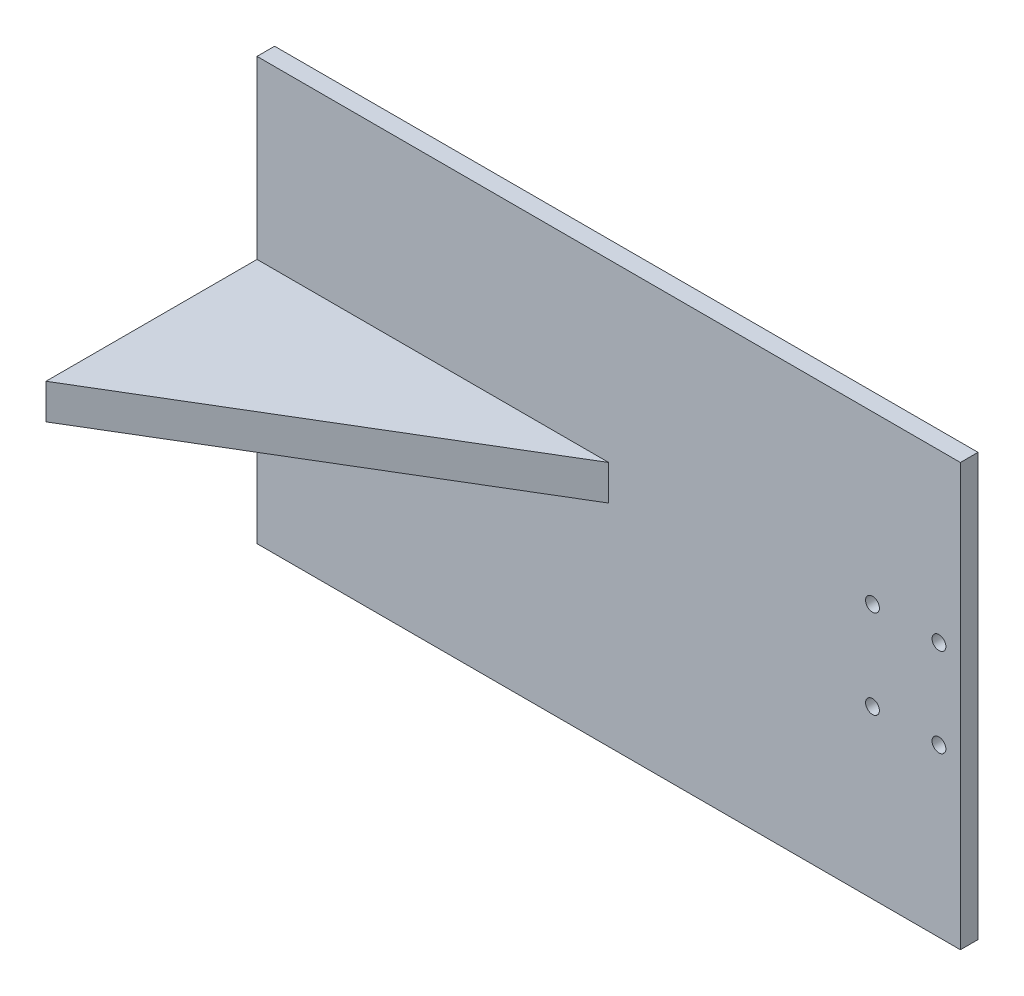
ISO-10303-21;
HEADER;
FILE_DESCRIPTION(('STEP AP214'),'2;1');
FILE_NAME('part.step','',(''),(''),'','','');
FILE_SCHEMA(('AUTOMOTIVE_DESIGN { 1 0 10303 214 1 1 1 1 }'));
ENDSEC;
DATA;
#1=APPLICATION_CONTEXT('core data for automotive mechanical design processes');
#2=APPLICATION_PROTOCOL_DEFINITION('international standard','automotive_design',2000,#1);
#3=PRODUCT_CONTEXT('',#1,'mechanical');
#4=PRODUCT('Part','Part','',(#3));
#5=PRODUCT_RELATED_PRODUCT_CATEGORY('part','',(#4));
#6=PRODUCT_DEFINITION_FORMATION('','',#4);
#7=PRODUCT_DEFINITION_CONTEXT('part definition',#1,'design');
#8=PRODUCT_DEFINITION('design','',#6,#7);
#9=PRODUCT_DEFINITION_SHAPE('','',#8);
#10=(LENGTH_UNIT() NAMED_UNIT(*) SI_UNIT(.MILLI.,.METRE.));
#11=(NAMED_UNIT(*) PLANE_ANGLE_UNIT() SI_UNIT($,.RADIAN.));
#12=(NAMED_UNIT(*) SI_UNIT($,.STERADIAN.) SOLID_ANGLE_UNIT());
#13=UNCERTAINTY_MEASURE_WITH_UNIT(LENGTH_MEASURE(1.E-05),#10,'distance_accuracy_value','');
#14=(GEOMETRIC_REPRESENTATION_CONTEXT(3) GLOBAL_UNCERTAINTY_ASSIGNED_CONTEXT((#13)) GLOBAL_UNIT_ASSIGNED_CONTEXT((#10,
#11,#12)) REPRESENTATION_CONTEXT('',''));
#15=CARTESIAN_POINT('',(0.,0.,0.));
#16=DIRECTION('',(0.,0.,1.));
#17=DIRECTION('',(1.,0.,0.));
#18=AXIS2_PLACEMENT_3D('',#15,#16,#17);
#19=CARTESIAN_POINT('',(0.,0.,1.5875));
#20=DIRECTION('',(0.,0.,1.));
#21=DIRECTION('',(1.,0.,0.));
#22=AXIS2_PLACEMENT_3D('',#19,#20,#21);
#23=PLANE('',#22);
#24=CARTESIAN_POINT('',(47.625,-8.,1.5875));
#25=DIRECTION('',(0.,0.,-1.));
#26=DIRECTION('',(1.,0.,0.));
#27=AXIS2_PLACEMENT_3D('',#24,#25,#26);
#28=CIRCLE('',#27,1.24968);
#29=CARTESIAN_POINT('',(48.87468,-8.,1.5875));
#30=VERTEX_POINT('',#29);
#31=EDGE_CURVE('E312',#30,#30,#28,.T.);
#32=ORIENTED_EDGE('',*,*,#31,.T.);
#33=EDGE_LOOP('',(#32));
#34=FACE_BOUND('',#33,.T.);
#35=CARTESIAN_POINT('',(59.625,-8.,1.5875));
#36=DIRECTION('',(0.,0.,-1.));
#37=DIRECTION('',(1.,0.,0.));
#38=AXIS2_PLACEMENT_3D('',#35,#36,#37);
#39=CIRCLE('',#38,1.24968);
#40=CARTESIAN_POINT('',(60.87468,-8.,1.5875));
#41=VERTEX_POINT('',#40);
#42=EDGE_CURVE('E303',#41,#41,#39,.T.);
#43=ORIENTED_EDGE('',*,*,#42,.T.);
#44=EDGE_LOOP('',(#43));
#45=FACE_BOUND('',#44,.T.);
#46=CARTESIAN_POINT('',(47.625,8.,1.5875));
#47=DIRECTION('',(0.,0.,1.));
#48=DIRECTION('',(1.,0.,0.));
#49=AXIS2_PLACEMENT_3D('',#46,#47,#48);
#50=CIRCLE('',#49,1.24968);
#51=CARTESIAN_POINT('',(48.87468,8.,1.5875));
#52=VERTEX_POINT('',#51);
#53=EDGE_CURVE('E325',#52,#52,#50,.T.);
#54=ORIENTED_EDGE('',*,*,#53,.F.);
#55=EDGE_LOOP('',(#54));
#56=FACE_BOUND('',#55,.T.);
#57=CARTESIAN_POINT('',(59.625,8.,1.5875));
#58=DIRECTION('',(0.,0.,1.));
#59=DIRECTION('',(1.,0.,0.));
#60=AXIS2_PLACEMENT_3D('',#57,#58,#59);
#61=CIRCLE('',#60,1.24968);
#62=CARTESIAN_POINT('',(60.87468,8.,1.5875));
#63=VERTEX_POINT('',#62);
#64=EDGE_CURVE('E136',#63,#63,#61,.T.);
#65=ORIENTED_EDGE('',*,*,#64,.F.);
#66=EDGE_LOOP('',(#65));
#67=FACE_BOUND('',#66,.T.);
#68=DIRECTION('',(0.,-1.,0.));
#69=VECTOR('',#68,1.);
#70=CARTESIAN_POINT('',(0.,6.35,1.5875));
#71=LINE('',#70,#69);
#72=CARTESIAN_POINT('',(0.,6.35,1.5875));
#73=VERTEX_POINT('',#72);
#74=CARTESIAN_POINT('',(0.,0.,1.5875));
#75=VERTEX_POINT('',#74);
#76=EDGE_CURVE('E295',#73,#75,#71,.T.);
#77=ORIENTED_EDGE('',*,*,#76,.T.);
#78=DIRECTION('',(-1.,0.,0.));
#79=VECTOR('',#78,1.);
#80=CARTESIAN_POINT('',(0.,0.,1.5875));
#81=LINE('',#80,#79);
#82=CARTESIAN_POINT('',(-63.5,0.,1.5875));
#83=VERTEX_POINT('',#82);
#84=EDGE_CURVE('E55',#75,#83,#81,.T.);
#85=ORIENTED_EDGE('',*,*,#84,.T.);
#86=DIRECTION('',(0.,-1.,0.));
#87=VECTOR('',#86,1.);
#88=CARTESIAN_POINT('',(-63.5,38.1,1.5875));
#89=LINE('',#88,#87);
#90=CARTESIAN_POINT('',(-63.5,-38.1,1.5875));
#91=VERTEX_POINT('',#90);
#92=EDGE_CURVE('E91',#83,#91,#89,.T.);
#93=ORIENTED_EDGE('',*,*,#92,.T.);
#94=DIRECTION('',(1.,0.,0.));
#95=VECTOR('',#94,1.);
#96=CARTESIAN_POINT('',(-63.5,-38.1,1.5875));
#97=LINE('',#96,#95);
#98=CARTESIAN_POINT('',(63.5,-38.1,1.5875));
#99=VERTEX_POINT('',#98);
#100=EDGE_CURVE('E129',#91,#99,#97,.T.);
#101=ORIENTED_EDGE('',*,*,#100,.T.);
#102=DIRECTION('',(0.,1.,0.));
#103=VECTOR('',#102,1.);
#104=CARTESIAN_POINT('',(63.5,38.1,1.5875));
#105=LINE('',#104,#103);
#106=CARTESIAN_POINT('',(63.5,38.1,1.5875));
#107=VERTEX_POINT('',#106);
#108=EDGE_CURVE('E133',#99,#107,#105,.T.);
#109=ORIENTED_EDGE('',*,*,#108,.T.);
#110=DIRECTION('',(-1.,0.,0.));
#111=VECTOR('',#110,1.);
#112=CARTESIAN_POINT('',(-63.5,38.1,1.5875));
#113=LINE('',#112,#111);
#114=CARTESIAN_POINT('',(-63.5,38.1,1.5875));
#115=VERTEX_POINT('',#114);
#116=EDGE_CURVE('E64',#107,#115,#113,.T.);
#117=ORIENTED_EDGE('',*,*,#116,.T.);
#118=CARTESIAN_POINT('',(-63.5,6.35,1.5875));
#119=VERTEX_POINT('',#118);
#120=EDGE_CURVE('E112',#115,#119,#89,.T.);
#121=ORIENTED_EDGE('',*,*,#120,.T.);
#122=DIRECTION('',(-1.,0.,0.));
#123=VECTOR('',#122,1.);
#124=CARTESIAN_POINT('',(0.,6.35,1.5875));
#125=LINE('',#124,#123);
#126=EDGE_CURVE('E119',#73,#119,#125,.T.);
#127=ORIENTED_EDGE('',*,*,#126,.F.);
#128=EDGE_LOOP('',(#77,#85,#93,#101,#109,#117,#121,#127));
#129=FACE_BOUND('',#128,.T.);
#130=ADVANCED_FACE('F39',(#34,#45,#56,#67,#129),#23,.T.);
#131=CARTESIAN_POINT('',(-63.5,38.1,1.5875));
#132=DIRECTION('',(1.,0.,0.));
#133=DIRECTION('',(0.,0.,-1.));
#134=AXIS2_PLACEMENT_3D('',#131,#132,#133);
#135=PLANE('',#134);
#136=DIRECTION('',(0.,-1.,0.));
#137=VECTOR('',#136,1.);
#138=CARTESIAN_POINT('',(-63.5,38.1,-1.5875));
#139=LINE('',#138,#137);
#140=CARTESIAN_POINT('',(-63.5,38.1,-1.5875));
#141=VERTEX_POINT('',#140);
#142=CARTESIAN_POINT('',(-63.5,-38.1,-1.5875));
#143=VERTEX_POINT('',#142);
#144=EDGE_CURVE('E144',#141,#143,#139,.T.);
#145=ORIENTED_EDGE('',*,*,#144,.T.);
#146=DIRECTION('',(0.,0.,-1.));
#147=VECTOR('',#146,1.);
#148=CARTESIAN_POINT('',(-63.5,-38.1,1.5875));
#149=LINE('',#148,#147);
#150=EDGE_CURVE('E11',#91,#143,#149,.T.);
#151=ORIENTED_EDGE('',*,*,#150,.F.);
#152=ORIENTED_EDGE('',*,*,#92,.F.);
#153=DIRECTION('',(0.,0.,1.));
#154=VECTOR('',#153,1.);
#155=CARTESIAN_POINT('',(-63.5,0.,1.5875));
#156=LINE('',#155,#154);
#157=CARTESIAN_POINT('',(-63.5,0.,39.6875));
#158=VERTEX_POINT('',#157);
#159=EDGE_CURVE('E297',#83,#158,#156,.T.);
#160=ORIENTED_EDGE('',*,*,#159,.T.);
#161=DIRECTION('',(0.,-1.,0.));
#162=VECTOR('',#161,1.);
#163=CARTESIAN_POINT('',(-63.5,6.35,39.6875));
#164=LINE('',#163,#162);
#165=CARTESIAN_POINT('',(-63.5,6.35,39.6875));
#166=VERTEX_POINT('',#165);
#167=EDGE_CURVE('E114',#166,#158,#164,.T.);
#168=ORIENTED_EDGE('',*,*,#167,.F.);
#169=DIRECTION('',(0.,0.,1.));
#170=VECTOR('',#169,1.);
#171=CARTESIAN_POINT('',(-63.5,6.35,1.5875));
#172=LINE('',#171,#170);
#173=EDGE_CURVE('E109',#119,#166,#172,.T.);
#174=ORIENTED_EDGE('',*,*,#173,.F.);
#175=ORIENTED_EDGE('',*,*,#120,.F.);
#176=DIRECTION('',(0.,0.,-1.));
#177=VECTOR('',#176,1.);
#178=CARTESIAN_POINT('',(-63.5,38.1,1.5875));
#179=LINE('',#178,#177);
#180=EDGE_CURVE('E143',#115,#141,#179,.T.);
#181=ORIENTED_EDGE('',*,*,#180,.T.);
#182=EDGE_LOOP('',(#145,#151,#152,#160,#168,#174,#175,#181));
#183=FACE_BOUND('',#182,.T.);
#184=ADVANCED_FACE('F41',(#183),#135,.F.);
#185=CARTESIAN_POINT('',(-63.5,-38.1,1.5875));
#186=DIRECTION('',(0.,1.,0.));
#187=DIRECTION('',(-1.,0.,0.));
#188=AXIS2_PLACEMENT_3D('',#185,#186,#187);
#189=PLANE('',#188);
#190=DIRECTION('',(1.,0.,0.));
#191=VECTOR('',#190,1.);
#192=CARTESIAN_POINT('',(-63.5,-38.1,-1.5875));
#193=LINE('',#192,#191);
#194=CARTESIAN_POINT('',(63.5,-38.1,-1.5875));
#195=VERTEX_POINT('',#194);
#196=EDGE_CURVE('E147',#143,#195,#193,.T.);
#197=ORIENTED_EDGE('',*,*,#196,.T.);
#198=DIRECTION('',(0.,0.,-1.));
#199=VECTOR('',#198,1.);
#200=CARTESIAN_POINT('',(63.5,-38.1,1.5875));
#201=LINE('',#200,#199);
#202=EDGE_CURVE('E48',#99,#195,#201,.T.);
#203=ORIENTED_EDGE('',*,*,#202,.F.);
#204=ORIENTED_EDGE('',*,*,#100,.F.);
#205=ORIENTED_EDGE('',*,*,#150,.T.);
#206=EDGE_LOOP('',(#197,#203,#204,#205));
#207=FACE_BOUND('',#206,.T.);
#208=ADVANCED_FACE('F183',(#207),#189,.F.);
#209=CARTESIAN_POINT('',(63.5,38.1,1.5875));
#210=DIRECTION('',(-1.,0.,0.));
#211=DIRECTION('',(0.,0.,1.));
#212=AXIS2_PLACEMENT_3D('',#209,#210,#211);
#213=PLANE('',#212);
#214=DIRECTION('',(0.,1.,0.));
#215=VECTOR('',#214,1.);
#216=CARTESIAN_POINT('',(63.5,38.1,-1.5875));
#217=LINE('',#216,#215);
#218=CARTESIAN_POINT('',(63.5,38.1,-1.5875));
#219=VERTEX_POINT('',#218);
#220=EDGE_CURVE('E151',#195,#219,#217,.T.);
#221=ORIENTED_EDGE('',*,*,#220,.T.);
#222=DIRECTION('',(0.,0.,-1.));
#223=VECTOR('',#222,1.);
#224=CARTESIAN_POINT('',(63.5,38.1,1.5875));
#225=LINE('',#224,#223);
#226=EDGE_CURVE('E158',#107,#219,#225,.T.);
#227=ORIENTED_EDGE('',*,*,#226,.F.);
#228=ORIENTED_EDGE('',*,*,#108,.F.);
#229=ORIENTED_EDGE('',*,*,#202,.T.);
#230=EDGE_LOOP('',(#221,#227,#228,#229));
#231=FACE_BOUND('',#230,.T.);
#232=ADVANCED_FACE('F166',(#231),#213,.F.);
#233=CARTESIAN_POINT('',(-63.5,38.1,1.5875));
#234=DIRECTION('',(0.,-1.,0.));
#235=DIRECTION('',(0.,0.,-1.));
#236=AXIS2_PLACEMENT_3D('',#233,#234,#235);
#237=PLANE('',#236);
#238=DIRECTION('',(-1.,0.,0.));
#239=VECTOR('',#238,1.);
#240=CARTESIAN_POINT('',(-63.5,38.1,-1.5875));
#241=LINE('',#240,#239);
#242=EDGE_CURVE('E85',#219,#141,#241,.T.);
#243=ORIENTED_EDGE('',*,*,#242,.T.);
#244=ORIENTED_EDGE('',*,*,#180,.F.);
#245=ORIENTED_EDGE('',*,*,#116,.F.);
#246=ORIENTED_EDGE('',*,*,#226,.T.);
#247=EDGE_LOOP('',(#243,#244,#245,#246));
#248=FACE_BOUND('',#247,.T.);
#249=ADVANCED_FACE('F173',(#248),#237,.F.);
#250=CARTESIAN_POINT('',(0.,0.,-1.5875));
#251=DIRECTION('',(0.,0.,1.));
#252=DIRECTION('',(1.,0.,0.));
#253=AXIS2_PLACEMENT_3D('',#250,#251,#252);
#254=PLANE('',#253);
#255=CARTESIAN_POINT('',(47.625,-8.,-1.5875));
#256=DIRECTION('',(0.,0.,-1.));
#257=DIRECTION('',(1.,0.,0.));
#258=AXIS2_PLACEMENT_3D('',#255,#256,#257);
#259=CIRCLE('',#258,1.24968);
#260=CARTESIAN_POINT('',(48.87468,-8.,-1.5875));
#261=VERTEX_POINT('',#260);
#262=EDGE_CURVE('E308',#261,#261,#259,.T.);
#263=ORIENTED_EDGE('',*,*,#262,.F.);
#264=EDGE_LOOP('',(#263));
#265=FACE_BOUND('',#264,.T.);
#266=CARTESIAN_POINT('',(59.625,-8.,-1.5875));
#267=DIRECTION('',(0.,0.,-1.));
#268=DIRECTION('',(1.,0.,0.));
#269=AXIS2_PLACEMENT_3D('',#266,#267,#268);
#270=CIRCLE('',#269,1.24968);
#271=CARTESIAN_POINT('',(60.87468,-8.,-1.5875));
#272=VERTEX_POINT('',#271);
#273=EDGE_CURVE('E315',#272,#272,#270,.T.);
#274=ORIENTED_EDGE('',*,*,#273,.F.);
#275=EDGE_LOOP('',(#274));
#276=FACE_BOUND('',#275,.T.);
#277=CARTESIAN_POINT('',(47.625,8.,-1.5875));
#278=DIRECTION('',(0.,0.,1.));
#279=DIRECTION('',(1.,0.,0.));
#280=AXIS2_PLACEMENT_3D('',#277,#278,#279);
#281=CIRCLE('',#280,1.24968);
#282=CARTESIAN_POINT('',(48.87468,8.,-1.5875));
#283=VERTEX_POINT('',#282);
#284=EDGE_CURVE('E148',#283,#283,#281,.T.);
#285=ORIENTED_EDGE('',*,*,#284,.T.);
#286=EDGE_LOOP('',(#285));
#287=FACE_BOUND('',#286,.T.);
#288=CARTESIAN_POINT('',(59.625,8.,-1.5875));
#289=DIRECTION('',(0.,0.,1.));
#290=DIRECTION('',(1.,0.,0.));
#291=AXIS2_PLACEMENT_3D('',#288,#289,#290);
#292=CIRCLE('',#291,1.24968);
#293=CARTESIAN_POINT('',(60.87468,8.,-1.5875));
#294=VERTEX_POINT('',#293);
#295=EDGE_CURVE('E328',#294,#294,#292,.T.);
#296=ORIENTED_EDGE('',*,*,#295,.T.);
#297=EDGE_LOOP('',(#296));
#298=FACE_BOUND('',#297,.T.);
#299=ORIENTED_EDGE('',*,*,#144,.F.);
#300=ORIENTED_EDGE('',*,*,#242,.F.);
#301=ORIENTED_EDGE('',*,*,#220,.F.);
#302=ORIENTED_EDGE('',*,*,#196,.F.);
#303=EDGE_LOOP('',(#299,#300,#301,#302));
#304=FACE_BOUND('',#303,.T.);
#305=ADVANCED_FACE('F171',(#265,#276,#287,#298,#304),#254,.F.);
#306=CARTESIAN_POINT('',(59.625,8.,-1.5875));
#307=DIRECTION('',(0.,0.,1.));
#308=DIRECTION('',(1.,0.,0.));
#309=AXIS2_PLACEMENT_3D('',#306,#307,#308);
#310=CYLINDRICAL_SURFACE('',#309,1.24968);
#311=ORIENTED_EDGE('',*,*,#295,.F.);
#312=EDGE_LOOP('',(#311));
#313=FACE_BOUND('',#312,.T.);
#314=ORIENTED_EDGE('',*,*,#64,.T.);
#315=EDGE_LOOP('',(#314));
#316=FACE_BOUND('',#315,.T.);
#317=ADVANCED_FACE('F180',(#313,#316),#310,.F.);
#318=CARTESIAN_POINT('',(47.625,8.,-1.5875));
#319=DIRECTION('',(0.,0.,1.));
#320=DIRECTION('',(1.,0.,0.));
#321=AXIS2_PLACEMENT_3D('',#318,#319,#320);
#322=CYLINDRICAL_SURFACE('',#321,1.24968);
#323=ORIENTED_EDGE('',*,*,#284,.F.);
#324=EDGE_LOOP('',(#323));
#325=FACE_BOUND('',#324,.T.);
#326=ORIENTED_EDGE('',*,*,#53,.T.);
#327=EDGE_LOOP('',(#326));
#328=FACE_BOUND('',#327,.T.);
#329=ADVANCED_FACE('F198',(#325,#328),#322,.F.);
#330=CARTESIAN_POINT('',(59.625,-8.,-1.5875));
#331=DIRECTION('',(0.,0.,1.));
#332=DIRECTION('',(1.,0.,0.));
#333=AXIS2_PLACEMENT_3D('',#330,#331,#332);
#334=CYLINDRICAL_SURFACE('',#333,1.24968);
#335=ORIENTED_EDGE('',*,*,#273,.T.);
#336=EDGE_LOOP('',(#335));
#337=FACE_BOUND('',#336,.T.);
#338=ORIENTED_EDGE('',*,*,#42,.F.);
#339=EDGE_LOOP('',(#338));
#340=FACE_BOUND('',#339,.T.);
#341=ADVANCED_FACE('F202',(#337,#340),#334,.F.);
#342=CARTESIAN_POINT('',(47.625,-8.,-1.5875));
#343=DIRECTION('',(0.,0.,1.));
#344=DIRECTION('',(1.,0.,0.));
#345=AXIS2_PLACEMENT_3D('',#342,#343,#344);
#346=CYLINDRICAL_SURFACE('',#345,1.24968);
#347=ORIENTED_EDGE('',*,*,#262,.T.);
#348=EDGE_LOOP('',(#347));
#349=FACE_BOUND('',#348,.T.);
#350=ORIENTED_EDGE('',*,*,#31,.F.);
#351=EDGE_LOOP('',(#350));
#352=FACE_BOUND('',#351,.T.);
#353=ADVANCED_FACE('F206',(#349,#352),#346,.F.);
#354=CARTESIAN_POINT('',(-63.5,6.35,39.6875));
#355=DIRECTION('',(-0.514495755427527,0.,-0.857492925712544));
#356=DIRECTION('',(-0.857492925712544,0.,0.514495755427527));
#357=AXIS2_PLACEMENT_3D('',#354,#355,#356);
#358=PLANE('',#357);
#359=DIRECTION('',(0.857492925712544,0.,-0.514495755427527));
#360=VECTOR('',#359,1.);
#361=CARTESIAN_POINT('',(-63.5,0.,39.6875));
#362=LINE('',#361,#360);
#363=EDGE_CURVE('E126',#158,#75,#362,.T.);
#364=ORIENTED_EDGE('',*,*,#363,.T.);
#365=ORIENTED_EDGE('',*,*,#76,.F.);
#366=DIRECTION('',(0.857492925712544,0.,-0.514495755427527));
#367=VECTOR('',#366,1.);
#368=CARTESIAN_POINT('',(-63.5,6.35,39.6875));
#369=LINE('',#368,#367);
#370=EDGE_CURVE('E118',#166,#73,#369,.T.);
#371=ORIENTED_EDGE('',*,*,#370,.F.);
#372=ORIENTED_EDGE('',*,*,#167,.T.);
#373=EDGE_LOOP('',(#364,#365,#371,#372));
#374=FACE_BOUND('',#373,.T.);
#375=ADVANCED_FACE('F210',(#374),#358,.F.);
#376=CARTESIAN_POINT('',(0.,6.35,0.));
#377=DIRECTION('',(0.,1.,0.));
#378=DIRECTION('',(0.,0.,1.));
#379=AXIS2_PLACEMENT_3D('',#376,#377,#378);
#380=PLANE('',#379);
#381=ORIENTED_EDGE('',*,*,#126,.T.);
#382=ORIENTED_EDGE('',*,*,#173,.T.);
#383=ORIENTED_EDGE('',*,*,#370,.T.);
#384=EDGE_LOOP('',(#381,#382,#383));
#385=FACE_BOUND('',#384,.T.);
#386=ADVANCED_FACE('F122',(#385),#380,.T.);
#387=CARTESIAN_POINT('',(0.,0.,0.));
#388=DIRECTION('',(0.,1.,0.));
#389=DIRECTION('',(0.,0.,1.));
#390=AXIS2_PLACEMENT_3D('',#387,#388,#389);
#391=PLANE('',#390);
#392=ORIENTED_EDGE('',*,*,#84,.F.);
#393=ORIENTED_EDGE('',*,*,#363,.F.);
#394=ORIENTED_EDGE('',*,*,#159,.F.);
#395=EDGE_LOOP('',(#392,#393,#394));
#396=FACE_BOUND('',#395,.T.);
#397=ADVANCED_FACE('F215',(#396),#391,.F.);
#398=CLOSED_SHELL('',(#130,#184,#208,#232,#249,#305,#317,#329,#341,#353,#375,#386,#397));
#399=MANIFOLD_SOLID_BREP('B2',#398);
#400=ADVANCED_BREP_SHAPE_REPRESENTATION('',(#18,#399),#14);
#401=SHAPE_DEFINITION_REPRESENTATION(#9,#400);
ENDSEC;
END-ISO-10303-21;
